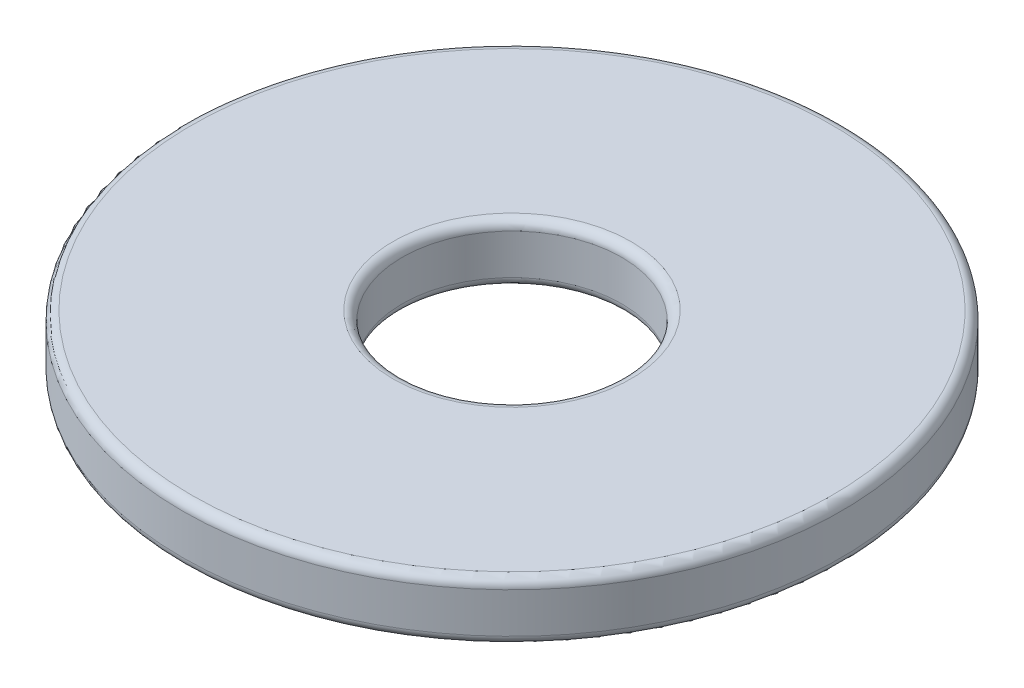
ISO-10303-21;
HEADER;
FILE_DESCRIPTION(('STEP AP214'),'2;1');
FILE_NAME('part.step','',(''),(''),'','','');
FILE_SCHEMA(('AUTOMOTIVE_DESIGN { 1 0 10303 214 1 1 1 1 }'));
ENDSEC;
DATA;
#1=APPLICATION_CONTEXT('core data for automotive mechanical design processes');
#2=APPLICATION_PROTOCOL_DEFINITION('international standard','automotive_design',2000,#1);
#3=PRODUCT_CONTEXT('',#1,'mechanical');
#4=PRODUCT('Part','Part','',(#3));
#5=PRODUCT_RELATED_PRODUCT_CATEGORY('part','',(#4));
#6=PRODUCT_DEFINITION_FORMATION('','',#4);
#7=PRODUCT_DEFINITION_CONTEXT('part definition',#1,'design');
#8=PRODUCT_DEFINITION('design','',#6,#7);
#9=PRODUCT_DEFINITION_SHAPE('','',#8);
#10=(LENGTH_UNIT() NAMED_UNIT(*) SI_UNIT(.MILLI.,.METRE.));
#11=(NAMED_UNIT(*) PLANE_ANGLE_UNIT() SI_UNIT($,.RADIAN.));
#12=(NAMED_UNIT(*) SI_UNIT($,.STERADIAN.) SOLID_ANGLE_UNIT());
#13=UNCERTAINTY_MEASURE_WITH_UNIT(LENGTH_MEASURE(1.E-05),#10,'distance_accuracy_value','');
#14=(GEOMETRIC_REPRESENTATION_CONTEXT(3) GLOBAL_UNCERTAINTY_ASSIGNED_CONTEXT((#13)) GLOBAL_UNIT_ASSIGNED_CONTEXT((#10,
#11,#12)) REPRESENTATION_CONTEXT('',''));
#15=CARTESIAN_POINT('',(0.,0.,0.));
#16=DIRECTION('',(0.,0.,1.));
#17=DIRECTION('',(1.,0.,0.));
#18=AXIS2_PLACEMENT_3D('',#15,#16,#17);
#19=CARTESIAN_POINT('',(0.,1.6,0.));
#20=DIRECTION('',(0.,1.,0.));
#21=DIRECTION('',(0.,0.,1.));
#22=AXIS2_PLACEMENT_3D('',#19,#20,#21);
#23=PLANE('',#22);
#24=CARTESIAN_POINT('',(0.,1.6,0.));
#25=DIRECTION('',(0.,1.,0.));
#26=DIRECTION('',(0.,0.,1.));
#27=AXIS2_PLACEMENT_3D('',#24,#25,#26);
#28=CIRCLE('',#27,3.25);
#29=CARTESIAN_POINT('',(0.,1.6,3.25));
#30=VERTEX_POINT('',#29);
#31=EDGE_CURVE('E10',#30,#30,#28,.F.);
#32=ORIENTED_EDGE('',*,*,#31,.T.);
#33=EDGE_LOOP('',(#32));
#34=FACE_BOUND('',#33,.T.);
#35=CARTESIAN_POINT('',(0.,1.6,0.));
#36=DIRECTION('',(0.,1.,0.));
#37=DIRECTION('',(0.,0.,1.));
#38=AXIS2_PLACEMENT_3D('',#35,#36,#37);
#39=CIRCLE('',#38,8.75);
#40=CARTESIAN_POINT('',(0.,1.6,8.75));
#41=VERTEX_POINT('',#40);
#42=EDGE_CURVE('E43',#41,#41,#39,.T.);
#43=ORIENTED_EDGE('',*,*,#42,.T.);
#44=EDGE_LOOP('',(#43));
#45=FACE_BOUND('',#44,.T.);
#46=ADVANCED_FACE('F36',(#34,#45),#23,.T.);
#47=CARTESIAN_POINT('',(0.,0.,0.));
#48=DIRECTION('',(0.,1.,0.));
#49=DIRECTION('',(0.,0.,1.));
#50=AXIS2_PLACEMENT_3D('',#47,#48,#49);
#51=PLANE('',#50);
#52=CARTESIAN_POINT('',(0.,0.,0.));
#53=DIRECTION('',(0.,1.,0.));
#54=DIRECTION('',(0.,0.,1.));
#55=AXIS2_PLACEMENT_3D('',#52,#53,#54);
#56=CIRCLE('',#55,3.25);
#57=CARTESIAN_POINT('',(0.,0.,3.25));
#58=VERTEX_POINT('',#57);
#59=EDGE_CURVE('E62',#58,#58,#56,.T.);
#60=ORIENTED_EDGE('',*,*,#59,.T.);
#61=EDGE_LOOP('',(#60));
#62=FACE_BOUND('',#61,.T.);
#63=CARTESIAN_POINT('',(0.,0.,0.));
#64=DIRECTION('',(0.,1.,0.));
#65=DIRECTION('',(0.,0.,1.));
#66=AXIS2_PLACEMENT_3D('',#63,#64,#65);
#67=CIRCLE('',#66,8.75);
#68=CARTESIAN_POINT('',(0.,0.,8.75));
#69=VERTEX_POINT('',#68);
#70=EDGE_CURVE('E65',#69,#69,#67,.F.);
#71=ORIENTED_EDGE('',*,*,#70,.T.);
#72=EDGE_LOOP('',(#71));
#73=FACE_BOUND('',#72,.T.);
#74=ADVANCED_FACE('F69',(#62,#73),#51,.F.);
#75=CARTESIAN_POINT('',(0.,1.6,0.));
#76=DIRECTION('',(0.,-1.,0.));
#77=DIRECTION('',(0.,0.,-1.));
#78=AXIS2_PLACEMENT_3D('',#75,#76,#77);
#79=CYLINDRICAL_SURFACE('',#78,9.);
#80=CARTESIAN_POINT('',(0.,0.25,0.));
#81=DIRECTION('',(0.,1.,0.));
#82=DIRECTION('',(0.,0.,1.));
#83=AXIS2_PLACEMENT_3D('',#80,#81,#82);
#84=CIRCLE('',#83,9.);
#85=CARTESIAN_POINT('',(0.,0.25,9.));
#86=VERTEX_POINT('',#85);
#87=EDGE_CURVE('E47',#86,#86,#84,.T.);
#88=ORIENTED_EDGE('',*,*,#87,.T.);
#89=EDGE_LOOP('',(#88));
#90=FACE_BOUND('',#89,.T.);
#91=CARTESIAN_POINT('',(0.,1.35,0.));
#92=DIRECTION('',(0.,1.,0.));
#93=DIRECTION('',(0.,0.,1.));
#94=AXIS2_PLACEMENT_3D('',#91,#92,#93);
#95=CIRCLE('',#94,9.);
#96=CARTESIAN_POINT('',(0.,1.35,9.));
#97=VERTEX_POINT('',#96);
#98=EDGE_CURVE('E51',#97,#97,#95,.F.);
#99=ORIENTED_EDGE('',*,*,#98,.T.);
#100=EDGE_LOOP('',(#99));
#101=FACE_BOUND('',#100,.T.);
#102=ADVANCED_FACE('F79',(#90,#101),#79,.T.);
#103=CARTESIAN_POINT('',(0.,1.6,0.));
#104=DIRECTION('',(0.,-1.,0.));
#105=DIRECTION('',(0.,0.,-1.));
#106=AXIS2_PLACEMENT_3D('',#103,#104,#105);
#107=CYLINDRICAL_SURFACE('',#106,3.);
#108=CARTESIAN_POINT('',(0.,0.25,0.));
#109=DIRECTION('',(0.,1.,0.));
#110=DIRECTION('',(0.,0.,1.));
#111=AXIS2_PLACEMENT_3D('',#108,#109,#110);
#112=CIRCLE('',#111,3.);
#113=CARTESIAN_POINT('',(0.,0.25,3.));
#114=VERTEX_POINT('',#113);
#115=EDGE_CURVE('E56',#114,#114,#112,.F.);
#116=ORIENTED_EDGE('',*,*,#115,.T.);
#117=EDGE_LOOP('',(#116));
#118=FACE_BOUND('',#117,.T.);
#119=CARTESIAN_POINT('',(0.,1.35,0.));
#120=DIRECTION('',(0.,1.,0.));
#121=DIRECTION('',(0.,0.,1.));
#122=AXIS2_PLACEMENT_3D('',#119,#120,#121);
#123=CIRCLE('',#122,3.);
#124=CARTESIAN_POINT('',(0.,1.35,3.));
#125=VERTEX_POINT('',#124);
#126=EDGE_CURVE('E59',#125,#125,#123,.T.);
#127=ORIENTED_EDGE('',*,*,#126,.T.);
#128=EDGE_LOOP('',(#127));
#129=FACE_BOUND('',#128,.T.);
#130=ADVANCED_FACE('F82',(#118,#129),#107,.F.);
#131=CARTESIAN_POINT('',(0.,0.25,0.));
#132=DIRECTION('',(0.,1.,0.));
#133=DIRECTION('',(0.,0.,1.));
#134=AXIS2_PLACEMENT_3D('',#131,#132,#133);
#135=TOROIDAL_SURFACE('',#134,3.25,0.25);
#136=ORIENTED_EDGE('',*,*,#115,.F.);
#137=EDGE_LOOP('',(#136));
#138=FACE_BOUND('',#137,.T.);
#139=ORIENTED_EDGE('',*,*,#59,.F.);
#140=EDGE_LOOP('',(#139));
#141=FACE_BOUND('',#140,.T.);
#142=ADVANCED_FACE('F75',(#138,#141),#135,.T.);
#143=CARTESIAN_POINT('',(0.,0.25,0.));
#144=DIRECTION('',(0.,1.,0.));
#145=DIRECTION('',(0.,0.,1.));
#146=AXIS2_PLACEMENT_3D('',#143,#144,#145);
#147=TOROIDAL_SURFACE('',#146,8.75,0.25);
#148=ORIENTED_EDGE('',*,*,#70,.F.);
#149=EDGE_LOOP('',(#148));
#150=FACE_BOUND('',#149,.T.);
#151=ORIENTED_EDGE('',*,*,#87,.F.);
#152=EDGE_LOOP('',(#151));
#153=FACE_BOUND('',#152,.T.);
#154=ADVANCED_FACE('F71',(#150,#153),#147,.T.);
#155=CARTESIAN_POINT('',(0.,1.35,0.));
#156=DIRECTION('',(0.,1.,0.));
#157=DIRECTION('',(0.,0.,1.));
#158=AXIS2_PLACEMENT_3D('',#155,#156,#157);
#159=TOROIDAL_SURFACE('',#158,3.25,0.25);
#160=ORIENTED_EDGE('',*,*,#31,.F.);
#161=EDGE_LOOP('',(#160));
#162=FACE_BOUND('',#161,.T.);
#163=ORIENTED_EDGE('',*,*,#126,.F.);
#164=EDGE_LOOP('',(#163));
#165=FACE_BOUND('',#164,.T.);
#166=ADVANCED_FACE('F74',(#162,#165),#159,.T.);
#167=CARTESIAN_POINT('',(0.,1.35,0.));
#168=DIRECTION('',(0.,1.,0.));
#169=DIRECTION('',(0.,0.,1.));
#170=AXIS2_PLACEMENT_3D('',#167,#168,#169);
#171=TOROIDAL_SURFACE('',#170,8.75,0.25);
#172=ORIENTED_EDGE('',*,*,#98,.F.);
#173=EDGE_LOOP('',(#172));
#174=FACE_BOUND('',#173,.T.);
#175=ORIENTED_EDGE('',*,*,#42,.F.);
#176=EDGE_LOOP('',(#175));
#177=FACE_BOUND('',#176,.T.);
#178=ADVANCED_FACE('F38',(#174,#177),#171,.T.);
#179=CLOSED_SHELL('',(#46,#74,#102,#130,#142,#154,#166,#178));
#180=MANIFOLD_SOLID_BREP('B2',#179);
#181=ADVANCED_BREP_SHAPE_REPRESENTATION('',(#18,#180),#14);
#182=SHAPE_DEFINITION_REPRESENTATION(#9,#181);
ENDSEC;
END-ISO-10303-21;
